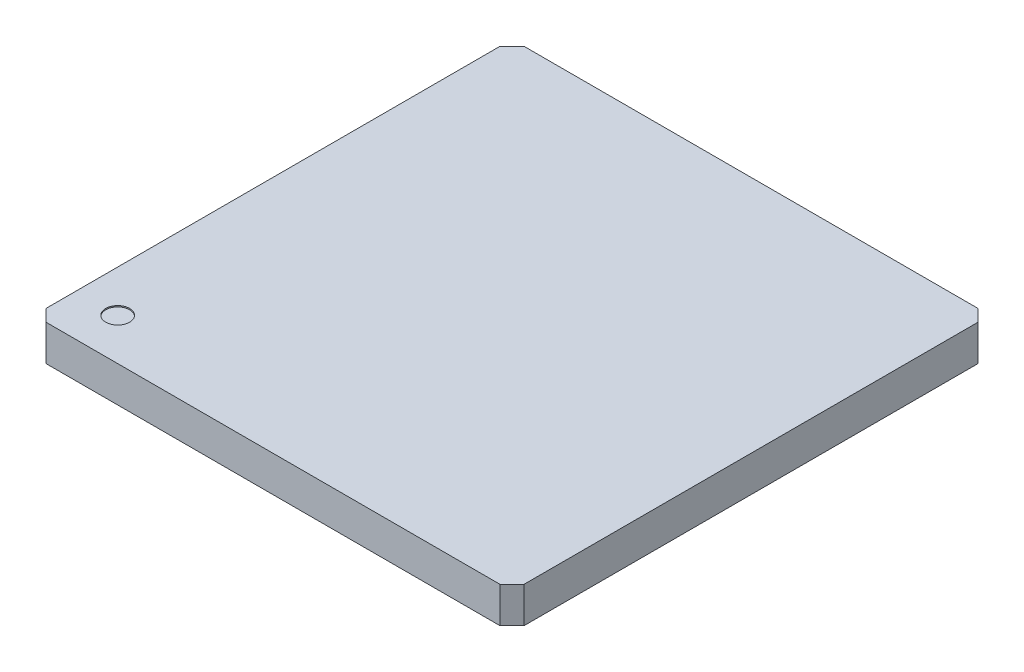
ISO-10303-21;
HEADER;
FILE_DESCRIPTION(('STEP AP214'),'2;1');
FILE_NAME('part.step','',(''),(''),'','','');
FILE_SCHEMA(('AUTOMOTIVE_DESIGN { 1 0 10303 214 1 1 1 1 }'));
ENDSEC;
DATA;
#1=APPLICATION_CONTEXT('core data for automotive mechanical design processes');
#2=APPLICATION_PROTOCOL_DEFINITION('international standard','automotive_design',2000,#1);
#3=PRODUCT_CONTEXT('',#1,'mechanical');
#4=PRODUCT('Part','Part','',(#3));
#5=PRODUCT_RELATED_PRODUCT_CATEGORY('part','',(#4));
#6=PRODUCT_DEFINITION_FORMATION('','',#4);
#7=PRODUCT_DEFINITION_CONTEXT('part definition',#1,'design');
#8=PRODUCT_DEFINITION('design','',#6,#7);
#9=PRODUCT_DEFINITION_SHAPE('','',#8);
#10=(LENGTH_UNIT() NAMED_UNIT(*) SI_UNIT(.MILLI.,.METRE.));
#11=(NAMED_UNIT(*) PLANE_ANGLE_UNIT() SI_UNIT($,.RADIAN.));
#12=(NAMED_UNIT(*) SI_UNIT($,.STERADIAN.) SOLID_ANGLE_UNIT());
#13=UNCERTAINTY_MEASURE_WITH_UNIT(LENGTH_MEASURE(1.E-05),#10,'distance_accuracy_value','');
#14=(GEOMETRIC_REPRESENTATION_CONTEXT(3) GLOBAL_UNCERTAINTY_ASSIGNED_CONTEXT((#13)) GLOBAL_UNIT_ASSIGNED_CONTEXT((#10,
#11,#12)) REPRESENTATION_CONTEXT('',''));
#15=CARTESIAN_POINT('',(0.,0.,0.));
#16=DIRECTION('',(0.,0.,1.));
#17=DIRECTION('',(1.,0.,0.));
#18=AXIS2_PLACEMENT_3D('',#15,#16,#17);
#19=CARTESIAN_POINT('',(-8.25,1.55,8.25));
#20=DIRECTION('',(0.,1.,0.));
#21=DIRECTION('',(0.,0.,1.));
#22=AXIS2_PLACEMENT_3D('',#19,#20,#21);
#23=PLANE('',#22);
#24=CARTESIAN_POINT('',(-8.25,1.55,8.25));
#25=DIRECTION('',(0.,1.,0.));
#26=DIRECTION('',(0.,0.,1.));
#27=AXIS2_PLACEMENT_3D('',#24,#25,#26);
#28=CIRCLE('',#27,0.5);
#29=CARTESIAN_POINT('',(-8.25,1.55,8.75));
#30=VERTEX_POINT('',#29);
#31=EDGE_CURVE('E20',#30,#30,#28,.T.);
#32=ORIENTED_EDGE('',*,*,#31,.T.);
#33=EDGE_LOOP('',(#32));
#34=FACE_BOUND('',#33,.T.);
#35=ADVANCED_FACE('F17',(#34),#23,.T.);
#36=CARTESIAN_POINT('',(-8.25,1.55,8.25));
#37=DIRECTION('',(0.,1.,0.));
#38=DIRECTION('',(0.,0.,1.));
#39=AXIS2_PLACEMENT_3D('',#36,#37,#38);
#40=CYLINDRICAL_SURFACE('',#39,0.5);
#41=ORIENTED_EDGE('',*,*,#31,.F.);
#42=EDGE_LOOP('',(#41));
#43=FACE_BOUND('',#42,.T.);
#44=CARTESIAN_POINT('',(-8.25,1.6,8.25));
#45=DIRECTION('',(0.,1.,0.));
#46=DIRECTION('',(0.,0.,1.));
#47=AXIS2_PLACEMENT_3D('',#44,#45,#46);
#48=CIRCLE('',#47,0.5);
#49=CARTESIAN_POINT('',(-8.25,1.6,8.75));
#50=VERTEX_POINT('',#49);
#51=EDGE_CURVE('E102',#50,#50,#48,.T.);
#52=ORIENTED_EDGE('',*,*,#51,.T.);
#53=EDGE_LOOP('',(#52));
#54=FACE_BOUND('',#53,.T.);
#55=ADVANCED_FACE('F123',(#43,#54),#40,.F.);
#56=CARTESIAN_POINT('',(-9.5,1.6,10.));
#57=DIRECTION('',(0.707106781186548,0.,-0.707106781186548));
#58=DIRECTION('',(-0.707106781186548,0.,-0.707106781186548));
#59=AXIS2_PLACEMENT_3D('',#56,#57,#58);
#60=PLANE('',#59);
#61=DIRECTION('',(-0.707106781186547,0.,-0.707106781186547));
#62=VECTOR('',#61,1.);
#63=CARTESIAN_POINT('',(-9.5,1.6,10.));
#64=LINE('',#63,#62);
#65=CARTESIAN_POINT('',(-9.5,1.6,10.));
#66=VERTEX_POINT('',#65);
#67=CARTESIAN_POINT('',(-10.,1.6,9.5));
#68=VERTEX_POINT('',#67);
#69=EDGE_CURVE('E85',#66,#68,#64,.T.);
#70=ORIENTED_EDGE('',*,*,#69,.T.);
#71=DIRECTION('',(0.,1.,0.));
#72=VECTOR('',#71,1.);
#73=CARTESIAN_POINT('',(-10.,1.6,9.5));
#74=LINE('',#73,#72);
#75=CARTESIAN_POINT('',(-10.,0.0999999999999994,9.5));
#76=VERTEX_POINT('',#75);
#77=EDGE_CURVE('E290',#68,#76,#74,.F.);
#78=ORIENTED_EDGE('',*,*,#77,.T.);
#79=DIRECTION('',(-0.707106781186548,0.,-0.707106781186548));
#80=VECTOR('',#79,1.);
#81=CARTESIAN_POINT('',(-9.5,0.0999999999999992,10.));
#82=LINE('',#81,#80);
#83=CARTESIAN_POINT('',(-9.5,0.0999999999999994,10.));
#84=VERTEX_POINT('',#83);
#85=EDGE_CURVE('E87',#84,#76,#82,.T.);
#86=ORIENTED_EDGE('',*,*,#85,.F.);
#87=DIRECTION('',(0.,1.,0.));
#88=VECTOR('',#87,1.);
#89=CARTESIAN_POINT('',(-9.5,1.6,10.));
#90=LINE('',#89,#88);
#91=EDGE_CURVE('E81',#84,#66,#90,.T.);
#92=ORIENTED_EDGE('',*,*,#91,.T.);
#93=EDGE_LOOP('',(#70,#78,#86,#92));
#94=FACE_BOUND('',#93,.T.);
#95=ADVANCED_FACE('F83',(#94),#60,.F.);
#96=CARTESIAN_POINT('',(-10.,1.6,-9.5));
#97=DIRECTION('',(0.707106781186548,0.,0.707106781186548));
#98=DIRECTION('',(0.707106781186548,0.,-0.707106781186548));
#99=AXIS2_PLACEMENT_3D('',#96,#97,#98);
#100=PLANE('',#99);
#101=DIRECTION('',(0.707106781186547,0.,-0.707106781186547));
#102=VECTOR('',#101,1.);
#103=CARTESIAN_POINT('',(-10.,1.6,-9.5));
#104=LINE('',#103,#102);
#105=CARTESIAN_POINT('',(-10.,1.6,-9.5));
#106=VERTEX_POINT('',#105);
#107=CARTESIAN_POINT('',(-9.5,1.6,-10.));
#108=VERTEX_POINT('',#107);
#109=EDGE_CURVE('E115',#106,#108,#104,.T.);
#110=ORIENTED_EDGE('',*,*,#109,.T.);
#111=DIRECTION('',(0.,1.,0.));
#112=VECTOR('',#111,1.);
#113=CARTESIAN_POINT('',(-9.5,1.6,-10.));
#114=LINE('',#113,#112);
#115=CARTESIAN_POINT('',(-9.5,0.0999999999999994,-10.));
#116=VERTEX_POINT('',#115);
#117=EDGE_CURVE('E272',#108,#116,#114,.F.);
#118=ORIENTED_EDGE('',*,*,#117,.T.);
#119=DIRECTION('',(0.707106781186548,0.,-0.707106781186548));
#120=VECTOR('',#119,1.);
#121=CARTESIAN_POINT('',(-10.,0.0999999999999992,-9.5));
#122=LINE('',#121,#120);
#123=CARTESIAN_POINT('',(-10.,0.0999999999999994,-9.5));
#124=VERTEX_POINT('',#123);
#125=EDGE_CURVE('E118',#124,#116,#122,.T.);
#126=ORIENTED_EDGE('',*,*,#125,.F.);
#127=DIRECTION('',(0.,1.,0.));
#128=VECTOR('',#127,1.);
#129=CARTESIAN_POINT('',(-10.,1.6,-9.5));
#130=LINE('',#129,#128);
#131=EDGE_CURVE('E107',#124,#106,#130,.T.);
#132=ORIENTED_EDGE('',*,*,#131,.T.);
#133=EDGE_LOOP('',(#110,#118,#126,#132));
#134=FACE_BOUND('',#133,.T.);
#135=ADVANCED_FACE('F136',(#134),#100,.F.);
#136=CARTESIAN_POINT('',(9.5,1.6,10.));
#137=DIRECTION('',(-0.707106781186548,0.,-0.707106781186548));
#138=DIRECTION('',(-0.707106781186548,0.,0.707106781186548));
#139=AXIS2_PLACEMENT_3D('',#136,#137,#138);
#140=PLANE('',#139);
#141=DIRECTION('',(-0.707106781186547,0.,0.707106781186547));
#142=VECTOR('',#141,1.);
#143=CARTESIAN_POINT('',(10.,1.6,9.5));
#144=LINE('',#143,#142);
#145=CARTESIAN_POINT('',(10.,1.6,9.5));
#146=VERTEX_POINT('',#145);
#147=CARTESIAN_POINT('',(9.5,1.6,10.));
#148=VERTEX_POINT('',#147);
#149=EDGE_CURVE('E76',#146,#148,#144,.T.);
#150=ORIENTED_EDGE('',*,*,#149,.T.);
#151=DIRECTION('',(0.,1.,0.));
#152=VECTOR('',#151,1.);
#153=CARTESIAN_POINT('',(9.5,1.6,10.));
#154=LINE('',#153,#152);
#155=CARTESIAN_POINT('',(9.5,0.0999999999999994,10.));
#156=VERTEX_POINT('',#155);
#157=EDGE_CURVE('E105',#148,#156,#154,.F.);
#158=ORIENTED_EDGE('',*,*,#157,.T.);
#159=DIRECTION('',(-0.707106781186548,0.,0.707106781186548));
#160=VECTOR('',#159,1.);
#161=CARTESIAN_POINT('',(9.5,0.0999999999999992,10.));
#162=LINE('',#161,#160);
#163=CARTESIAN_POINT('',(10.,0.0999999999999994,9.5));
#164=VERTEX_POINT('',#163);
#165=EDGE_CURVE('E35',#164,#156,#162,.T.);
#166=ORIENTED_EDGE('',*,*,#165,.F.);
#167=DIRECTION('',(0.,1.,0.));
#168=VECTOR('',#167,1.);
#169=CARTESIAN_POINT('',(10.,1.6,9.5));
#170=LINE('',#169,#168);
#171=EDGE_CURVE('E283',#164,#146,#170,.T.);
#172=ORIENTED_EDGE('',*,*,#171,.T.);
#173=EDGE_LOOP('',(#150,#158,#166,#172));
#174=FACE_BOUND('',#173,.T.);
#175=ADVANCED_FACE('F127',(#174),#140,.F.);
#176=CARTESIAN_POINT('',(-10.,1.6,-10.));
#177=DIRECTION('',(0.,-1.,0.));
#178=DIRECTION('',(0.,0.,-1.));
#179=AXIS2_PLACEMENT_3D('',#176,#177,#178);
#180=PLANE('',#179);
#181=ORIENTED_EDGE('',*,*,#51,.F.);
#182=EDGE_LOOP('',(#181));
#183=FACE_BOUND('',#182,.T.);
#184=DIRECTION('',(-1.,0.,0.));
#185=VECTOR('',#184,1.);
#186=CARTESIAN_POINT('',(-9.5,1.6,10.));
#187=LINE('',#186,#185);
#188=EDGE_CURVE('E92',#66,#148,#187,.F.);
#189=ORIENTED_EDGE('',*,*,#188,.T.);
#190=ORIENTED_EDGE('',*,*,#149,.F.);
#191=DIRECTION('',(0.,0.,1.));
#192=VECTOR('',#191,1.);
#193=CARTESIAN_POINT('',(10.,1.6,9.5));
#194=LINE('',#193,#192);
#195=CARTESIAN_POINT('',(10.,1.6,-9.5));
#196=VERTEX_POINT('',#195);
#197=EDGE_CURVE('E285',#146,#196,#194,.F.);
#198=ORIENTED_EDGE('',*,*,#197,.T.);
#199=DIRECTION('',(0.707106781186548,0.,0.707106781186548));
#200=VECTOR('',#199,1.);
#201=CARTESIAN_POINT('',(9.5,1.6,-10.));
#202=LINE('',#201,#200);
#203=CARTESIAN_POINT('',(9.5,1.6,-10.));
#204=VERTEX_POINT('',#203);
#205=EDGE_CURVE('E93',#196,#204,#202,.F.);
#206=ORIENTED_EDGE('',*,*,#205,.T.);
#207=DIRECTION('',(1.,0.,0.));
#208=VECTOR('',#207,1.);
#209=CARTESIAN_POINT('',(-9.5,1.6,-10.));
#210=LINE('',#209,#208);
#211=EDGE_CURVE('E276',#204,#108,#210,.F.);
#212=ORIENTED_EDGE('',*,*,#211,.T.);
#213=ORIENTED_EDGE('',*,*,#109,.F.);
#214=DIRECTION('',(0.,0.,-1.));
#215=VECTOR('',#214,1.);
#216=CARTESIAN_POINT('',(-10.,1.6,9.5));
#217=LINE('',#216,#215);
#218=EDGE_CURVE('E100',#106,#68,#217,.F.);
#219=ORIENTED_EDGE('',*,*,#218,.T.);
#220=ORIENTED_EDGE('',*,*,#69,.F.);
#221=EDGE_LOOP('',(#189,#190,#198,#206,#212,#213,#219,#220));
#222=FACE_BOUND('',#221,.T.);
#223=ADVANCED_FACE('F96',(#183,#222),#180,.F.);
#224=CARTESIAN_POINT('',(9.5,1.6,-10.));
#225=DIRECTION('',(-0.707106781186548,0.,0.707106781186548));
#226=DIRECTION('',(0.707106781186548,0.,0.707106781186548));
#227=AXIS2_PLACEMENT_3D('',#224,#225,#226);
#228=PLANE('',#227);
#229=ORIENTED_EDGE('',*,*,#205,.F.);
#230=DIRECTION('',(0.,1.,0.));
#231=VECTOR('',#230,1.);
#232=CARTESIAN_POINT('',(10.,1.6,-9.5));
#233=LINE('',#232,#231);
#234=CARTESIAN_POINT('',(10.,0.0999999999999994,-9.5));
#235=VERTEX_POINT('',#234);
#236=EDGE_CURVE('E298',#196,#235,#233,.F.);
#237=ORIENTED_EDGE('',*,*,#236,.T.);
#238=DIRECTION('',(0.707106781186548,0.,0.707106781186548));
#239=VECTOR('',#238,1.);
#240=CARTESIAN_POINT('',(9.5,0.0999999999999992,-10.));
#241=LINE('',#240,#239);
#242=CARTESIAN_POINT('',(9.5,0.0999999999999994,-10.));
#243=VERTEX_POINT('',#242);
#244=EDGE_CURVE('E112',#243,#235,#241,.T.);
#245=ORIENTED_EDGE('',*,*,#244,.F.);
#246=DIRECTION('',(0.,1.,0.));
#247=VECTOR('',#246,1.);
#248=CARTESIAN_POINT('',(9.5,1.6,-10.));
#249=LINE('',#248,#247);
#250=EDGE_CURVE('E280',#243,#204,#249,.T.);
#251=ORIENTED_EDGE('',*,*,#250,.T.);
#252=EDGE_LOOP('',(#229,#237,#245,#251));
#253=FACE_BOUND('',#252,.T.);
#254=ADVANCED_FACE('F126',(#253),#228,.F.);
#255=CARTESIAN_POINT('',(-9.5,1.6,10.));
#256=DIRECTION('',(0.,0.,-1.));
#257=DIRECTION('',(-1.,0.,0.));
#258=AXIS2_PLACEMENT_3D('',#255,#256,#257);
#259=PLANE('',#258);
#260=ORIENTED_EDGE('',*,*,#188,.F.);
#261=ORIENTED_EDGE('',*,*,#91,.F.);
#262=DIRECTION('',(1.,0.,0.));
#263=VECTOR('',#262,1.);
#264=CARTESIAN_POINT('',(-10.,0.1,10.));
#265=LINE('',#264,#263);
#266=EDGE_CURVE('E295',#156,#84,#265,.F.);
#267=ORIENTED_EDGE('',*,*,#266,.F.);
#268=ORIENTED_EDGE('',*,*,#157,.F.);
#269=EDGE_LOOP('',(#260,#261,#267,#268));
#270=FACE_BOUND('',#269,.T.);
#271=ADVANCED_FACE('F104',(#270),#259,.F.);
#272=CARTESIAN_POINT('',(-10.,1.6,9.5));
#273=DIRECTION('',(1.,0.,0.));
#274=DIRECTION('',(0.,0.,-1.));
#275=AXIS2_PLACEMENT_3D('',#272,#273,#274);
#276=PLANE('',#275);
#277=ORIENTED_EDGE('',*,*,#218,.F.);
#278=ORIENTED_EDGE('',*,*,#131,.F.);
#279=DIRECTION('',(0.,0.,-1.));
#280=VECTOR('',#279,1.);
#281=CARTESIAN_POINT('',(-10.,0.1,-10.));
#282=LINE('',#281,#280);
#283=EDGE_CURVE('E294',#76,#124,#282,.T.);
#284=ORIENTED_EDGE('',*,*,#283,.F.);
#285=ORIENTED_EDGE('',*,*,#77,.F.);
#286=EDGE_LOOP('',(#277,#278,#284,#285));
#287=FACE_BOUND('',#286,.T.);
#288=ADVANCED_FACE('F152',(#287),#276,.F.);
#289=CARTESIAN_POINT('',(-9.5,1.6,-10.));
#290=DIRECTION('',(0.,0.,1.));
#291=DIRECTION('',(1.,0.,0.));
#292=AXIS2_PLACEMENT_3D('',#289,#290,#291);
#293=PLANE('',#292);
#294=ORIENTED_EDGE('',*,*,#211,.F.);
#295=ORIENTED_EDGE('',*,*,#250,.F.);
#296=DIRECTION('',(1.,0.,0.));
#297=VECTOR('',#296,1.);
#298=CARTESIAN_POINT('',(-10.,0.1,-10.));
#299=LINE('',#298,#297);
#300=EDGE_CURVE('E26',#116,#243,#299,.T.);
#301=ORIENTED_EDGE('',*,*,#300,.F.);
#302=ORIENTED_EDGE('',*,*,#117,.F.);
#303=EDGE_LOOP('',(#294,#295,#301,#302));
#304=FACE_BOUND('',#303,.T.);
#305=ADVANCED_FACE('F146',(#304),#293,.F.);
#306=CARTESIAN_POINT('',(10.,1.6,9.5));
#307=DIRECTION('',(-1.,0.,0.));
#308=DIRECTION('',(0.,0.,1.));
#309=AXIS2_PLACEMENT_3D('',#306,#307,#308);
#310=PLANE('',#309);
#311=ORIENTED_EDGE('',*,*,#197,.F.);
#312=ORIENTED_EDGE('',*,*,#171,.F.);
#313=DIRECTION('',(0.,0.,-1.));
#314=VECTOR('',#313,1.);
#315=CARTESIAN_POINT('',(10.,0.1,-10.));
#316=LINE('',#315,#314);
#317=EDGE_CURVE('E11',#235,#164,#316,.F.);
#318=ORIENTED_EDGE('',*,*,#317,.F.);
#319=ORIENTED_EDGE('',*,*,#236,.F.);
#320=EDGE_LOOP('',(#311,#312,#318,#319));
#321=FACE_BOUND('',#320,.T.);
#322=ADVANCED_FACE('F140',(#321),#310,.F.);
#323=CARTESIAN_POINT('',(-10.,0.1,-10.));
#324=DIRECTION('',(0.,-1.,0.));
#325=DIRECTION('',(0.,0.,-1.));
#326=AXIS2_PLACEMENT_3D('',#323,#324,#325);
#327=PLANE('',#326);
#328=ORIENTED_EDGE('',*,*,#317,.T.);
#329=ORIENTED_EDGE('',*,*,#165,.T.);
#330=ORIENTED_EDGE('',*,*,#266,.T.);
#331=ORIENTED_EDGE('',*,*,#85,.T.);
#332=ORIENTED_EDGE('',*,*,#283,.T.);
#333=ORIENTED_EDGE('',*,*,#125,.T.);
#334=ORIENTED_EDGE('',*,*,#300,.T.);
#335=ORIENTED_EDGE('',*,*,#244,.T.);
#336=EDGE_LOOP('',(#328,#329,#330,#331,#332,#333,#334,#335));
#337=FACE_BOUND('',#336,.T.);
#338=ADVANCED_FACE('F138',(#337),#327,.T.);
#339=CLOSED_SHELL('',(#35,#55,#95,#135,#175,#223,#254,#271,#288,#305,#322,#338));
#340=MANIFOLD_SOLID_BREP('B1',#339);
#341=ADVANCED_BREP_SHAPE_REPRESENTATION('',(#18,#340),#14);
#342=SHAPE_DEFINITION_REPRESENTATION(#9,#341);
ENDSEC;
END-ISO-10303-21;
